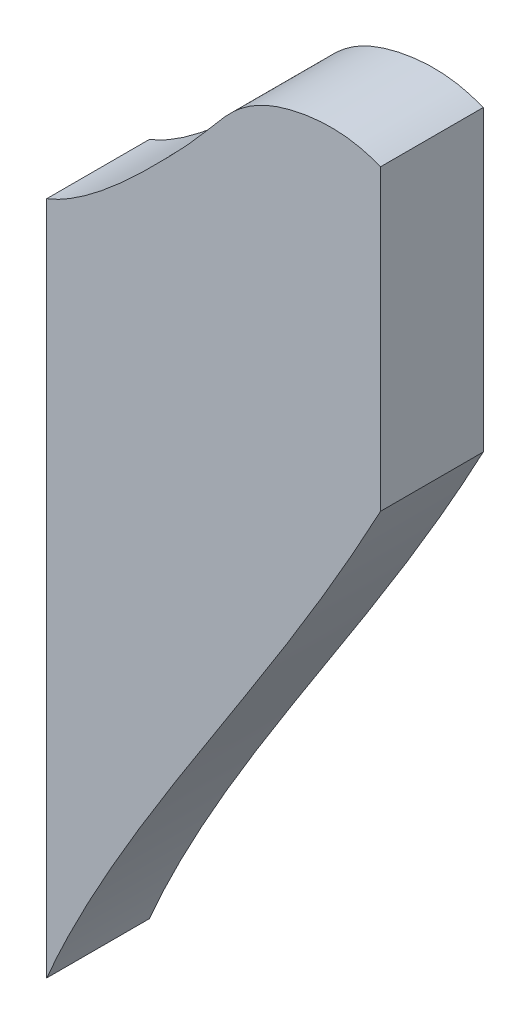
ISO-10303-21;
HEADER;
FILE_DESCRIPTION(('STEP AP214'),'2;1');
FILE_NAME('part.step','',(''),(''),'','','');
FILE_SCHEMA(('AUTOMOTIVE_DESIGN { 1 0 10303 214 1 1 1 1 }'));
ENDSEC;
DATA;
#1=APPLICATION_CONTEXT('core data for automotive mechanical design processes');
#2=APPLICATION_PROTOCOL_DEFINITION('international standard','automotive_design',2000,#1);
#3=PRODUCT_CONTEXT('',#1,'mechanical');
#4=PRODUCT('Part','Part','',(#3));
#5=PRODUCT_RELATED_PRODUCT_CATEGORY('part','',(#4));
#6=PRODUCT_DEFINITION_FORMATION('','',#4);
#7=PRODUCT_DEFINITION_CONTEXT('part definition',#1,'design');
#8=PRODUCT_DEFINITION('design','',#6,#7);
#9=PRODUCT_DEFINITION_SHAPE('','',#8);
#10=(LENGTH_UNIT() NAMED_UNIT(*) SI_UNIT(.MILLI.,.METRE.));
#11=(NAMED_UNIT(*) PLANE_ANGLE_UNIT() SI_UNIT($,.RADIAN.));
#12=(NAMED_UNIT(*) SI_UNIT($,.STERADIAN.) SOLID_ANGLE_UNIT());
#13=UNCERTAINTY_MEASURE_WITH_UNIT(LENGTH_MEASURE(1.E-05),#10,'distance_accuracy_value','');
#14=(GEOMETRIC_REPRESENTATION_CONTEXT(3) GLOBAL_UNCERTAINTY_ASSIGNED_CONTEXT((#13)) GLOBAL_UNIT_ASSIGNED_CONTEXT((#10,
#11,#12)) REPRESENTATION_CONTEXT('',''));
#15=CARTESIAN_POINT('',(0.,0.,0.));
#16=DIRECTION('',(0.,0.,1.));
#17=DIRECTION('',(1.,0.,0.));
#18=AXIS2_PLACEMENT_3D('',#15,#16,#17);
#19=CARTESIAN_POINT('',(64.0498013587317,-71.0985562802362,59.9999999999997));
#20=CARTESIAN_POINT('',(64.4729099561022,-70.107074900615,59.9999999999997));
#21=CARTESIAN_POINT('',(64.9207372381465,-69.1219707964749,59.9999999999997));
#22=CARTESIAN_POINT('',(65.8496220237943,-67.1767783434583,59.9999999999997));
#23=CARTESIAN_POINT('',(66.3315812561082,-66.2145809467212,59.9999999999997));
#24=CARTESIAN_POINT('',(67.819303747717,-63.3528298185521,59.9999999999997));
#25=CARTESIAN_POINT('',(68.8663775344763,-61.4777999827182,59.9999999999997));
#26=CARTESIAN_POINT('',(72.1104477278071,-55.9137664384054,59.9999999999997));
#27=CARTESIAN_POINT('',(74.411265090107,-52.2863957914113,59.9999999999997));
#28=CARTESIAN_POINT('',(77.889233840645,-46.8612155648743,59.9999999999997));
#29=CARTESIAN_POINT('',(79.0537052820553,-45.055878565294,59.9999999999997));
#30=CARTESIAN_POINT('',(81.3627107914429,-41.4333687921895,59.9999999999997));
#31=CARTESIAN_POINT('',(82.5060966562688,-39.615514390617,59.9999999999997));
#32=CARTESIAN_POINT('',(84.7503847642712,-35.9545852873231,59.9999999999997));
#33=CARTESIAN_POINT('',(85.8516493436866,-34.1111523110689,59.9999999999997));
#34=CARTESIAN_POINT('',(87.9953925662842,-30.3930943131016,59.9999999999997));
#35=CARTESIAN_POINT('',(89.0377244949023,-28.5183418741013,59.9999999999997));
#36=CARTESIAN_POINT('',(90.046469153013,-26.625711537127,59.9999999999997));
#37=B_SPLINE_CURVE_WITH_KNOTS('',3,(#19,#20,#21,#22,#23,#24,#25,#26,#27,#28,#29,#30,#31,#32,#33,
#34,#35,#36),.UNSPECIFIED.,.F.,.F.,(4,2,2,2,2,2,2,2,4),(0.,0.0624999999999998,0.125,0.25,0.5,
0.625,0.75,0.875,1.),.UNSPECIFIED.);
#38=DIRECTION('',(0.,0.,-1.));
#39=VECTOR('',#38,1.);
#40=SURFACE_OF_LINEAR_EXTRUSION('',#37,#39);
#41=CARTESIAN_POINT('',(64.0498013587317,-71.0985562802362,51.9999999999997));
#42=CARTESIAN_POINT('',(64.4729099561022,-70.107074900615,51.9999999999997));
#43=CARTESIAN_POINT('',(64.9207372381465,-69.1219707964749,51.9999999999997));
#44=CARTESIAN_POINT('',(65.8496220237943,-67.1767783434583,51.9999999999997));
#45=CARTESIAN_POINT('',(66.3315812561082,-66.2145809467212,51.9999999999997));
#46=CARTESIAN_POINT('',(67.819303747717,-63.3528298185521,51.9999999999997));
#47=CARTESIAN_POINT('',(68.8663775344763,-61.4777999827182,51.9999999999997));
#48=CARTESIAN_POINT('',(72.1104477278071,-55.9137664384054,51.9999999999997));
#49=CARTESIAN_POINT('',(74.411265090107,-52.2863957914113,51.9999999999997));
#50=CARTESIAN_POINT('',(77.889233840645,-46.8612155648743,51.9999999999997));
#51=CARTESIAN_POINT('',(79.0537052820553,-45.055878565294,51.9999999999997));
#52=CARTESIAN_POINT('',(81.3627107914429,-41.4333687921895,51.9999999999997));
#53=CARTESIAN_POINT('',(82.5060966562688,-39.615514390617,51.9999999999997));
#54=CARTESIAN_POINT('',(84.7503847642712,-35.9545852873231,51.9999999999997));
#55=CARTESIAN_POINT('',(85.8516493436866,-34.1111523110689,51.9999999999997));
#56=CARTESIAN_POINT('',(87.9953925662842,-30.3930943131016,51.9999999999997));
#57=CARTESIAN_POINT('',(89.0377244949023,-28.5183418741013,51.9999999999997));
#58=CARTESIAN_POINT('',(90.046469153013,-26.625711537127,51.9999999999997));
#59=B_SPLINE_CURVE_WITH_KNOTS('',3,(#41,#42,#43,#44,#45,#46,#47,#48,#49,#50,#51,#52,#53,#54,#55,
#56,#57,#58),.UNSPECIFIED.,.F.,.F.,(4,2,2,2,2,2,2,2,4),(0.,0.0624999999999998,0.125,0.25,0.5,
0.625,0.75,0.875,1.),.UNSPECIFIED.);
#60=CARTESIAN_POINT('',(64.0498013587316,-71.0985562802362,51.9999999999997));
#61=VERTEX_POINT('',#60);
#62=CARTESIAN_POINT('',(90.0464691530008,-26.6257115371504,51.9999999999997));
#63=VERTEX_POINT('',#62);
#64=EDGE_CURVE('E188',#61,#63,#59,.T.);
#65=ORIENTED_EDGE('',*,*,#64,.T.);
#66=DIRECTION('',(0.,0.,-1.));
#67=VECTOR('',#66,1.);
#68=CARTESIAN_POINT('',(90.0464691530008,-26.6257115371504,59.9999999999997));
#69=LINE('',#68,#67);
#70=CARTESIAN_POINT('',(90.0464691530008,-26.6257115371504,59.9999999999997));
#71=VERTEX_POINT('',#70);
#72=EDGE_CURVE('E11',#71,#63,#69,.T.);
#73=ORIENTED_EDGE('',*,*,#72,.F.);
#74=CARTESIAN_POINT('',(90.046469153013,-26.625711537127,59.9999999999997));
#75=CARTESIAN_POINT('',(89.0377244949023,-28.5183418741013,59.9999999999997));
#76=CARTESIAN_POINT('',(87.9953925662842,-30.3930943131016,59.9999999999997));
#77=CARTESIAN_POINT('',(85.8516493436866,-34.1111523110689,59.9999999999997));
#78=CARTESIAN_POINT('',(84.7503847642712,-35.9545852873231,59.9999999999997));
#79=CARTESIAN_POINT('',(82.5060966562688,-39.615514390617,59.9999999999997));
#80=CARTESIAN_POINT('',(81.3627107914429,-41.4333687921895,59.9999999999997));
#81=CARTESIAN_POINT('',(79.0537052820553,-45.055878565294,59.9999999999997));
#82=CARTESIAN_POINT('',(77.889233840645,-46.8612155648743,59.9999999999997));
#83=CARTESIAN_POINT('',(74.411265090107,-52.2863957914113,59.9999999999997));
#84=CARTESIAN_POINT('',(72.1104477278071,-55.9137664384054,59.9999999999997));
#85=CARTESIAN_POINT('',(68.8663775344763,-61.4777999827182,59.9999999999997));
#86=CARTESIAN_POINT('',(67.819303747717,-63.3528298185521,59.9999999999997));
#87=CARTESIAN_POINT('',(66.3315812561082,-66.2145809467212,59.9999999999997));
#88=CARTESIAN_POINT('',(65.8496220237943,-67.1767783434583,59.9999999999997));
#89=CARTESIAN_POINT('',(64.9207372381465,-69.1219707964749,59.9999999999997));
#90=CARTESIAN_POINT('',(64.4729099561022,-70.107074900615,59.9999999999997));
#91=CARTESIAN_POINT('',(64.0498013587317,-71.0985562802362,59.9999999999997));
#92=B_SPLINE_CURVE_WITH_KNOTS('',3,(#74,#75,#76,#77,#78,#79,#80,#81,#82,#83,#84,#85,#86,#87,#88,
#89,#90,#91),.UNSPECIFIED.,.F.,.F.,(4,2,2,2,2,2,2,2,4),(0.,0.125,0.25,0.375,0.5,0.75,0.875,
0.9375,1.),.UNSPECIFIED.);
#93=CARTESIAN_POINT('',(64.0498013587316,-71.0985562802362,59.9999999999997));
#94=VERTEX_POINT('',#93);
#95=EDGE_CURVE('E89',#94,#71,#92,.F.);
#96=ORIENTED_EDGE('',*,*,#95,.F.);
#97=DIRECTION('',(0.,0.,-1.));
#98=VECTOR('',#97,1.);
#99=CARTESIAN_POINT('',(64.0498013587316,-71.0985562802362,59.9999999999997));
#100=LINE('',#99,#98);
#101=EDGE_CURVE('E174',#94,#61,#100,.T.);
#102=ORIENTED_EDGE('',*,*,#101,.T.);
#103=EDGE_LOOP('',(#65,#73,#96,#102));
#104=FACE_BOUND('',#103,.T.);
#105=ADVANCED_FACE('F30',(#104),#40,.F.);
#106=CARTESIAN_POINT('',(90.0464691530008,-26.6257115371504,59.9999999999997));
#107=DIRECTION('',(-1.,5.2147318382724E-13,0.));
#108=DIRECTION('',(-5.2147318382724E-13,-1.,0.));
#109=AXIS2_PLACEMENT_3D('',#106,#107,#108);
#110=PLANE('',#109);
#111=DIRECTION('',(5.2147318382724E-13,1.,0.));
#112=VECTOR('',#111,1.);
#113=CARTESIAN_POINT('',(90.0464691530008,-26.6257115371504,51.9999999999997));
#114=LINE('',#113,#112);
#115=CARTESIAN_POINT('',(90.0464691530129,-3.39286058342667,51.9999999999997));
#116=VERTEX_POINT('',#115);
#117=EDGE_CURVE('E94',#63,#116,#114,.T.);
#118=ORIENTED_EDGE('',*,*,#117,.T.);
#119=DIRECTION('',(0.,0.,-1.));
#120=VECTOR('',#119,1.);
#121=CARTESIAN_POINT('',(90.0464691530129,-3.39286058342667,59.9999999999997));
#122=LINE('',#121,#120);
#123=CARTESIAN_POINT('',(90.0464691530129,-3.39286058342667,59.9999999999997));
#124=VERTEX_POINT('',#123);
#125=EDGE_CURVE('E43',#124,#116,#122,.T.);
#126=ORIENTED_EDGE('',*,*,#125,.F.);
#127=DIRECTION('',(5.2147318382724E-13,1.,0.));
#128=VECTOR('',#127,1.);
#129=CARTESIAN_POINT('',(90.0464691530008,-26.6257115371504,59.9999999999997));
#130=LINE('',#129,#128);
#131=EDGE_CURVE('E83',#71,#124,#130,.T.);
#132=ORIENTED_EDGE('',*,*,#131,.F.);
#133=ORIENTED_EDGE('',*,*,#72,.T.);
#134=EDGE_LOOP('',(#118,#126,#132,#133));
#135=FACE_BOUND('',#134,.T.);
#136=ADVANCED_FACE('F93',(#135),#110,.F.);
#137=CARTESIAN_POINT('',(90.0464691530129,-3.39286058342667,59.9999999999997));
#138=CARTESIAN_POINT('',(89.4256578120428,-3.15175083290409,59.9999999999997));
#139=CARTESIAN_POINT('',(88.7924949007325,-2.96179432952181,59.9999999999997));
#140=CARTESIAN_POINT('',(87.8190989013286,-2.77481131386873,59.9999999999997));
#141=CARTESIAN_POINT('',(87.4907495880232,-2.72856890014137,59.9999999999997));
#142=CARTESIAN_POINT('',(86.8263046157443,-2.66816507319668,59.9999999999997));
#143=CARTESIAN_POINT('',(86.4883514643792,-2.65400334882529,59.9999999999997));
#144=CARTESIAN_POINT('',(85.4808440502383,-2.65781727253943,59.9999999999997));
#145=CARTESIAN_POINT('',(84.8165250722645,-2.7205736259124,59.9999999999997));
#146=CARTESIAN_POINT('',(83.8283472714576,-2.88268574148777,59.9999999999997));
#147=CARTESIAN_POINT('',(83.5003226339552,-2.94792592577389,59.9999999999997));
#148=CARTESIAN_POINT('',(82.8473957545534,-3.10397688231844,59.9999999999997));
#149=CARTESIAN_POINT('',(82.5225470455089,-3.19486442304164,59.9999999999997));
#150=CARTESIAN_POINT('',(81.5694817481978,-3.50467413720909,59.9999999999997));
#151=CARTESIAN_POINT('',(80.9577380674114,-3.76256696958234,59.9999999999997));
#152=CARTESIAN_POINT('',(80.0863025892272,-4.24975176607898,59.9999999999997));
#153=CARTESIAN_POINT('',(79.8035540396827,-4.42894324787873,59.9999999999997));
#154=CARTESIAN_POINT('',(79.2546496610527,-4.82338086881964,59.9999999999997));
#155=CARTESIAN_POINT('',(78.9933537063252,-5.03513173275336,59.9999999999997));
#156=CARTESIAN_POINT('',(78.248511944601,-5.70430003870126,59.9999999999997));
#157=CARTESIAN_POINT('',(77.8032856300846,-6.19895344201063,59.9999999999997));
#158=CARTESIAN_POINT('',(76.9344791659484,-7.20872842183487,59.9999999999997));
#159=CARTESIAN_POINT('',(76.5122998713147,-7.72517461832889,59.9999999999997));
#160=CARTESIAN_POINT('',(75.6486077999892,-8.73978566395936,59.9999999999997));
#161=CARTESIAN_POINT('',(75.2043635017878,-9.23533095048617,59.9999999999997));
#162=CARTESIAN_POINT('',(74.2959981389342,-10.207428871582,59.9999999999997));
#163=CARTESIAN_POINT('',(73.8322727648033,-10.684382384188,59.9999999999997));
#164=CARTESIAN_POINT('',(72.4342109836112,-12.108679978705,59.9999999999997));
#165=CARTESIAN_POINT('',(71.4940956530256,-13.0516534784032,59.9999999999997));
#166=CARTESIAN_POINT('',(70.032119945329,-14.4081059837863,59.9999999999997));
#167=CARTESIAN_POINT('',(69.5359788022448,-14.8505273818039,59.9999999999997));
#168=CARTESIAN_POINT('',(68.5214275647098,-15.7107936530094,59.9999999999997));
#169=CARTESIAN_POINT('',(68.0021148296644,-16.1294381881882,59.9999999999997));
#170=CARTESIAN_POINT('',(66.939158676372,-16.9254719841377,59.9999999999997));
#171=CARTESIAN_POINT('',(66.3952428155558,-17.3035335915482,59.9999999999997));
#172=CARTESIAN_POINT('',(65.2640885451811,-17.9901497272683,59.9999999999997));
#173=CARTESIAN_POINT('',(64.6771359802384,-18.3007340612316,59.9999999999997));
#174=CARTESIAN_POINT('',(64.0498013587316,-18.5433479585356,59.9999999999997));
#175=B_SPLINE_CURVE_WITH_KNOTS('',3,(#137,#138,#139,#140,#141,#142,#143,#144,#145,#146,#147,
#148,#149,#150,#151,#152,#153,#154,#155,#156,#157,#158,#159,#160,#161,#162,#163,#164,#165,#166,
#167,#168,#169,#170,#171,#172,#173,#174),.UNSPECIFIED.,.F.,.F.,(4,2,2,2,2,2,2,2,2,2,2,2,2,2,2,2,
2,2,4),(0.,0.0625000000000028,0.0937500000000033,0.125000000000004,0.187500000000005,
0.218750000000005,0.250000000000005,0.312500000000004,0.343750000000003,0.375000000000003,
0.437500000000003,0.500000000000002,0.562500000000002,0.625000000000002,0.750000000000001,
0.812500000000001,0.875000000000001,0.9375,1.),.UNSPECIFIED.);
#176=DIRECTION('',(0.,0.,-1.));
#177=VECTOR('',#176,1.);
#178=SURFACE_OF_LINEAR_EXTRUSION('',#175,#177);
#179=CARTESIAN_POINT('',(90.0464691530129,-3.39286058342667,51.9999999999997));
#180=CARTESIAN_POINT('',(89.4256578120428,-3.15175083290409,51.9999999999997));
#181=CARTESIAN_POINT('',(88.7924949007325,-2.96179432952181,51.9999999999997));
#182=CARTESIAN_POINT('',(87.8190989013286,-2.77481131386873,51.9999999999997));
#183=CARTESIAN_POINT('',(87.4907495880232,-2.72856890014137,51.9999999999997));
#184=CARTESIAN_POINT('',(86.8263046157443,-2.66816507319668,51.9999999999997));
#185=CARTESIAN_POINT('',(86.4883514643792,-2.65400334882529,51.9999999999997));
#186=CARTESIAN_POINT('',(85.4808440502383,-2.65781727253943,51.9999999999997));
#187=CARTESIAN_POINT('',(84.8165250722645,-2.7205736259124,51.9999999999997));
#188=CARTESIAN_POINT('',(83.8283472714576,-2.88268574148777,51.9999999999997));
#189=CARTESIAN_POINT('',(83.5003226339552,-2.94792592577389,51.9999999999997));
#190=CARTESIAN_POINT('',(82.8473957545534,-3.10397688231844,51.9999999999997));
#191=CARTESIAN_POINT('',(82.5225470455089,-3.19486442304164,51.9999999999997));
#192=CARTESIAN_POINT('',(81.5694817481978,-3.50467413720909,51.9999999999997));
#193=CARTESIAN_POINT('',(80.9577380674114,-3.76256696958234,51.9999999999997));
#194=CARTESIAN_POINT('',(80.0863025892272,-4.24975176607898,51.9999999999997));
#195=CARTESIAN_POINT('',(79.8035540396827,-4.42894324787873,51.9999999999997));
#196=CARTESIAN_POINT('',(79.2546496610527,-4.82338086881964,51.9999999999997));
#197=CARTESIAN_POINT('',(78.9933537063252,-5.03513173275336,51.9999999999997));
#198=CARTESIAN_POINT('',(78.248511944601,-5.70430003870126,51.9999999999997));
#199=CARTESIAN_POINT('',(77.8032856300846,-6.19895344201063,51.9999999999997));
#200=CARTESIAN_POINT('',(76.9344791659484,-7.20872842183487,51.9999999999997));
#201=CARTESIAN_POINT('',(76.5122998713147,-7.72517461832889,51.9999999999997));
#202=CARTESIAN_POINT('',(75.6486077999892,-8.73978566395936,51.9999999999997));
#203=CARTESIAN_POINT('',(75.2043635017878,-9.23533095048617,51.9999999999997));
#204=CARTESIAN_POINT('',(74.2959981389342,-10.207428871582,51.9999999999997));
#205=CARTESIAN_POINT('',(73.8322727648033,-10.684382384188,51.9999999999997));
#206=CARTESIAN_POINT('',(72.4342109836112,-12.108679978705,51.9999999999997));
#207=CARTESIAN_POINT('',(71.4940956530256,-13.0516534784032,51.9999999999997));
#208=CARTESIAN_POINT('',(70.032119945329,-14.4081059837863,51.9999999999997));
#209=CARTESIAN_POINT('',(69.5359788022448,-14.8505273818039,51.9999999999997));
#210=CARTESIAN_POINT('',(68.5214275647098,-15.7107936530094,51.9999999999997));
#211=CARTESIAN_POINT('',(68.0021148296644,-16.1294381881882,51.9999999999997));
#212=CARTESIAN_POINT('',(66.939158676372,-16.9254719841377,51.9999999999997));
#213=CARTESIAN_POINT('',(66.3952428155558,-17.3035335915482,51.9999999999997));
#214=CARTESIAN_POINT('',(65.2640885451811,-17.9901497272683,51.9999999999997));
#215=CARTESIAN_POINT('',(64.6771359802384,-18.3007340612316,51.9999999999997));
#216=CARTESIAN_POINT('',(64.0498013587316,-18.5433479585356,51.9999999999997));
#217=B_SPLINE_CURVE_WITH_KNOTS('',3,(#179,#180,#181,#182,#183,#184,#185,#186,#187,#188,#189,
#190,#191,#192,#193,#194,#195,#196,#197,#198,#199,#200,#201,#202,#203,#204,#205,#206,#207,#208,
#209,#210,#211,#212,#213,#214,#215,#216),.UNSPECIFIED.,.F.,.F.,(4,2,2,2,2,2,2,2,2,2,2,2,2,2,2,2,
2,2,4),(0.,0.0625000000000028,0.0937500000000033,0.125000000000004,0.187500000000005,
0.218750000000005,0.250000000000005,0.312500000000004,0.343750000000003,0.375000000000003,
0.437500000000003,0.500000000000002,0.562500000000002,0.625000000000002,0.750000000000001,
0.812500000000001,0.875000000000001,0.9375,1.),.UNSPECIFIED.);
#218=CARTESIAN_POINT('',(64.0498013587316,-18.5433479585356,51.9999999999997));
#219=VERTEX_POINT('',#218);
#220=EDGE_CURVE('E69',#116,#219,#217,.T.);
#221=ORIENTED_EDGE('',*,*,#220,.T.);
#222=DIRECTION('',(0.,0.,-1.));
#223=VECTOR('',#222,1.);
#224=CARTESIAN_POINT('',(64.0498013587316,-18.5433479585356,59.9999999999997));
#225=LINE('',#224,#223);
#226=CARTESIAN_POINT('',(64.0498013587316,-18.5433479585356,59.9999999999997));
#227=VERTEX_POINT('',#226);
#228=EDGE_CURVE('E95',#227,#219,#225,.T.);
#229=ORIENTED_EDGE('',*,*,#228,.F.);
#230=CARTESIAN_POINT('',(64.0498013587316,-18.5433479585356,59.9999999999997));
#231=CARTESIAN_POINT('',(64.6771359802384,-18.3007340612316,59.9999999999997));
#232=CARTESIAN_POINT('',(65.2640885451811,-17.9901497272683,59.9999999999997));
#233=CARTESIAN_POINT('',(66.3952428155558,-17.3035335915482,59.9999999999997));
#234=CARTESIAN_POINT('',(66.939158676372,-16.9254719841377,59.9999999999997));
#235=CARTESIAN_POINT('',(68.0021148296644,-16.1294381881882,59.9999999999997));
#236=CARTESIAN_POINT('',(68.5214275647098,-15.7107936530094,59.9999999999997));
#237=CARTESIAN_POINT('',(69.5359788022448,-14.8505273818039,59.9999999999997));
#238=CARTESIAN_POINT('',(70.032119945329,-14.4081059837863,59.9999999999997));
#239=CARTESIAN_POINT('',(71.4940956530256,-13.0516534784032,59.9999999999997));
#240=CARTESIAN_POINT('',(72.4342109836112,-12.108679978705,59.9999999999997));
#241=CARTESIAN_POINT('',(73.8322727648033,-10.684382384188,59.9999999999997));
#242=CARTESIAN_POINT('',(74.2959981389342,-10.207428871582,59.9999999999997));
#243=CARTESIAN_POINT('',(75.2043635017878,-9.23533095048617,59.9999999999997));
#244=CARTESIAN_POINT('',(75.6486077999892,-8.73978566395936,59.9999999999997));
#245=CARTESIAN_POINT('',(76.5122998713147,-7.72517461832889,59.9999999999997));
#246=CARTESIAN_POINT('',(76.9344791659484,-7.20872842183487,59.9999999999997));
#247=CARTESIAN_POINT('',(77.8032856300846,-6.19895344201063,59.9999999999997));
#248=CARTESIAN_POINT('',(78.248511944601,-5.70430003870126,59.9999999999997));
#249=CARTESIAN_POINT('',(78.9933537063252,-5.03513173275336,59.9999999999997));
#250=CARTESIAN_POINT('',(79.2546496610527,-4.82338086881964,59.9999999999997));
#251=CARTESIAN_POINT('',(79.8035540396827,-4.42894324787873,59.9999999999997));
#252=CARTESIAN_POINT('',(80.0863025892272,-4.24975176607898,59.9999999999997));
#253=CARTESIAN_POINT('',(80.9577380674114,-3.76256696958234,59.9999999999997));
#254=CARTESIAN_POINT('',(81.5694817481978,-3.50467413720909,59.9999999999997));
#255=CARTESIAN_POINT('',(82.5225470455089,-3.19486442304164,59.9999999999997));
#256=CARTESIAN_POINT('',(82.8473957545534,-3.10397688231844,59.9999999999997));
#257=CARTESIAN_POINT('',(83.5003226339552,-2.94792592577389,59.9999999999997));
#258=CARTESIAN_POINT('',(83.8283472714576,-2.88268574148777,59.9999999999997));
#259=CARTESIAN_POINT('',(84.8165250722645,-2.7205736259124,59.9999999999997));
#260=CARTESIAN_POINT('',(85.4808440502383,-2.65781727253943,59.9999999999997));
#261=CARTESIAN_POINT('',(86.4883514643792,-2.65400334882529,59.9999999999997));
#262=CARTESIAN_POINT('',(86.8263046157443,-2.66816507319668,59.9999999999997));
#263=CARTESIAN_POINT('',(87.4907495880232,-2.72856890014137,59.9999999999997));
#264=CARTESIAN_POINT('',(87.8190989013286,-2.77481131386873,59.9999999999997));
#265=CARTESIAN_POINT('',(88.7924949007325,-2.96179432952181,59.9999999999997));
#266=CARTESIAN_POINT('',(89.4256578120428,-3.15175083290409,59.9999999999997));
#267=CARTESIAN_POINT('',(90.0464691530129,-3.39286058342667,59.9999999999997));
#268=B_SPLINE_CURVE_WITH_KNOTS('',3,(#230,#231,#232,#233,#234,#235,#236,#237,#238,#239,#240,
#241,#242,#243,#244,#245,#246,#247,#248,#249,#250,#251,#252,#253,#254,#255,#256,#257,#258,#259,
#260,#261,#262,#263,#264,#265,#266,#267),.UNSPECIFIED.,.F.,.F.,(4,2,2,2,2,2,2,2,2,2,2,2,2,2,2,2,
2,2,4),(0.,0.0624999999999998,0.124999999999999,0.187499999999999,0.249999999999999,
0.374999999999998,0.437499999999998,0.499999999999998,0.562499999999997,0.624999999999997,
0.656249999999997,0.687499999999996,0.749999999999995,0.781249999999995,0.812499999999995,
0.874999999999996,0.906249999999997,0.937499999999997,1.),.UNSPECIFIED.);
#269=EDGE_CURVE('E86',#124,#227,#268,.F.);
#270=ORIENTED_EDGE('',*,*,#269,.F.);
#271=ORIENTED_EDGE('',*,*,#125,.T.);
#272=EDGE_LOOP('',(#221,#229,#270,#271));
#273=FACE_BOUND('',#272,.T.);
#274=ADVANCED_FACE('F98',(#273),#178,.F.);
#275=CARTESIAN_POINT('',(64.0498013587316,-71.0985562802362,59.9999999999997));
#276=DIRECTION('',(1.,0.,0.));
#277=DIRECTION('',(0.,1.,0.));
#278=AXIS2_PLACEMENT_3D('',#275,#276,#277);
#279=PLANE('',#278);
#280=DIRECTION('',(0.,-1.,0.));
#281=VECTOR('',#280,1.);
#282=CARTESIAN_POINT('',(64.0498013587316,-71.0985562802362,51.9999999999997));
#283=LINE('',#282,#281);
#284=EDGE_CURVE('E76',#219,#61,#283,.T.);
#285=ORIENTED_EDGE('',*,*,#284,.T.);
#286=ORIENTED_EDGE('',*,*,#101,.F.);
#287=DIRECTION('',(0.,-1.,0.));
#288=VECTOR('',#287,1.);
#289=CARTESIAN_POINT('',(64.0498013587316,-71.0985562802362,59.9999999999997));
#290=LINE('',#289,#288);
#291=EDGE_CURVE('E52',#227,#94,#290,.T.);
#292=ORIENTED_EDGE('',*,*,#291,.F.);
#293=ORIENTED_EDGE('',*,*,#228,.T.);
#294=EDGE_LOOP('',(#285,#286,#292,#293));
#295=FACE_BOUND('',#294,.T.);
#296=ADVANCED_FACE('F117',(#295),#279,.F.);
#297=CARTESIAN_POINT('',(76.729910923799,-48.6696089737199,59.9999999999997));
#298=DIRECTION('',(0.,0.,1.));
#299=DIRECTION('',(1.,0.,0.));
#300=AXIS2_PLACEMENT_3D('',#297,#298,#299);
#301=PLANE('',#300);
#302=ORIENTED_EDGE('',*,*,#95,.T.);
#303=ORIENTED_EDGE('',*,*,#131,.T.);
#304=ORIENTED_EDGE('',*,*,#269,.T.);
#305=ORIENTED_EDGE('',*,*,#291,.T.);
#306=EDGE_LOOP('',(#302,#303,#304,#305));
#307=FACE_BOUND('',#306,.T.);
#308=ADVANCED_FACE('F84',(#307),#301,.T.);
#309=CARTESIAN_POINT('',(76.729910923799,-48.6696089737199,51.9999999999997));
#310=DIRECTION('',(0.,0.,1.));
#311=DIRECTION('',(1.,0.,0.));
#312=AXIS2_PLACEMENT_3D('',#309,#310,#311);
#313=PLANE('',#312);
#314=ORIENTED_EDGE('',*,*,#64,.F.);
#315=ORIENTED_EDGE('',*,*,#284,.F.);
#316=ORIENTED_EDGE('',*,*,#220,.F.);
#317=ORIENTED_EDGE('',*,*,#117,.F.);
#318=EDGE_LOOP('',(#314,#315,#316,#317));
#319=FACE_BOUND('',#318,.T.);
#320=ADVANCED_FACE('F147',(#319),#313,.F.);
#321=CLOSED_SHELL('',(#105,#136,#274,#296,#308,#320));
#322=MANIFOLD_SOLID_BREP('B2',#321);
#323=ADVANCED_BREP_SHAPE_REPRESENTATION('',(#18,#322),#14);
#324=SHAPE_DEFINITION_REPRESENTATION(#9,#323);
ENDSEC;
END-ISO-10303-21;
